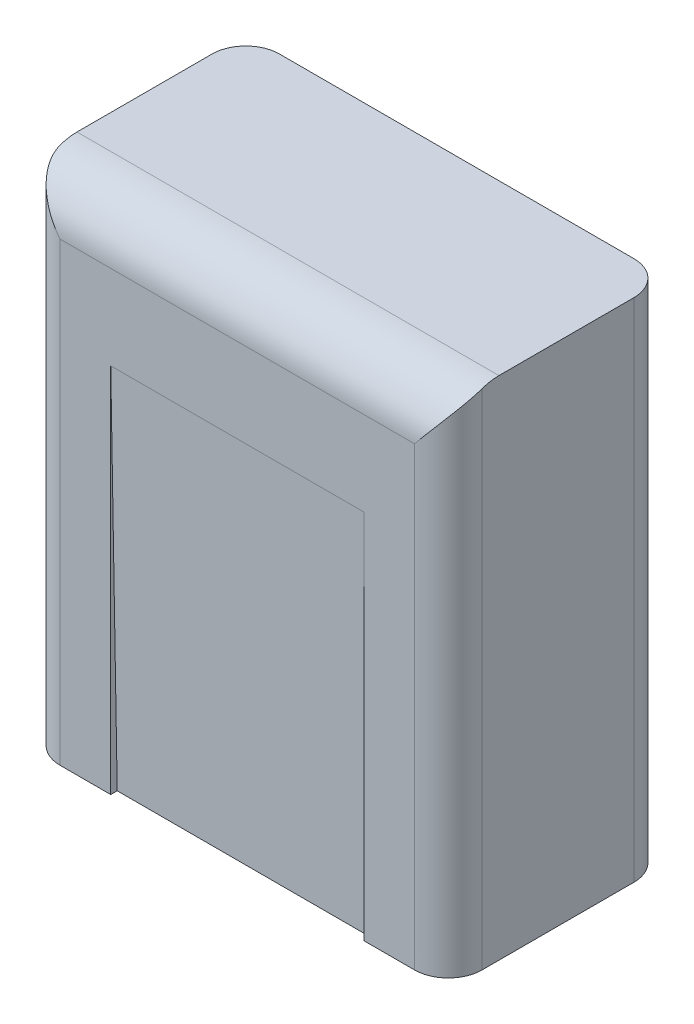
ISO-10303-21;
HEADER;
FILE_DESCRIPTION(('STEP AP214'),'2;1');
FILE_NAME('part.step','',(''),(''),'','','');
FILE_SCHEMA(('AUTOMOTIVE_DESIGN { 1 0 10303 214 1 1 1 1 }'));
ENDSEC;
DATA;
#1=APPLICATION_CONTEXT('core data for automotive mechanical design processes');
#2=APPLICATION_PROTOCOL_DEFINITION('international standard','automotive_design',2000,#1);
#3=PRODUCT_CONTEXT('',#1,'mechanical');
#4=PRODUCT('Part','Part','',(#3));
#5=PRODUCT_RELATED_PRODUCT_CATEGORY('part','',(#4));
#6=PRODUCT_DEFINITION_FORMATION('','',#4);
#7=PRODUCT_DEFINITION_CONTEXT('part definition',#1,'design');
#8=PRODUCT_DEFINITION('design','',#6,#7);
#9=PRODUCT_DEFINITION_SHAPE('','',#8);
#10=(LENGTH_UNIT() NAMED_UNIT(*) SI_UNIT(.MILLI.,.METRE.));
#11=(NAMED_UNIT(*) PLANE_ANGLE_UNIT() SI_UNIT($,.RADIAN.));
#12=(NAMED_UNIT(*) SI_UNIT($,.STERADIAN.) SOLID_ANGLE_UNIT());
#13=UNCERTAINTY_MEASURE_WITH_UNIT(LENGTH_MEASURE(1.E-05),#10,'distance_accuracy_value','');
#14=(GEOMETRIC_REPRESENTATION_CONTEXT(3) GLOBAL_UNCERTAINTY_ASSIGNED_CONTEXT((#13)) GLOBAL_UNIT_ASSIGNED_CONTEXT((#10,
#11,#12)) REPRESENTATION_CONTEXT('',''));
#15=CARTESIAN_POINT('',(0.,0.,0.));
#16=DIRECTION('',(0.,0.,1.));
#17=DIRECTION('',(1.,0.,0.));
#18=AXIS2_PLACEMENT_3D('',#15,#16,#17);
#19=CARTESIAN_POINT('',(-12.5,-30.,6.5));
#20=DIRECTION('',(0.,0.,1.));
#21=DIRECTION('',(1.,0.,0.));
#22=AXIS2_PLACEMENT_3D('',#19,#20,#21);
#23=PLANE('',#22);
#24=DIRECTION('',(1.,0.,0.));
#25=VECTOR('',#24,1.);
#26=CARTESIAN_POINT('',(-12.5,-30.,6.5));
#27=LINE('',#26,#25);
#28=CARTESIAN_POINT('',(-10.5,-30.,6.5));
#29=VERTEX_POINT('',#28);
#30=CARTESIAN_POINT('',(-7.5,-30.,6.5));
#31=VERTEX_POINT('',#30);
#32=EDGE_CURVE('E161',#29,#31,#27,.T.);
#33=ORIENTED_EDGE('',*,*,#32,.T.);
#34=DIRECTION('',(0.,-1.,0.));
#35=VECTOR('',#34,1.);
#36=CARTESIAN_POINT('',(-7.5,-30.,6.5));
#37=LINE('',#36,#35);
#38=CARTESIAN_POINT('',(-7.5,-8.,6.5));
#39=VERTEX_POINT('',#38);
#40=EDGE_CURVE('E147',#39,#31,#37,.T.);
#41=ORIENTED_EDGE('',*,*,#40,.F.);
#42=DIRECTION('',(1.,0.,0.));
#43=VECTOR('',#42,1.);
#44=CARTESIAN_POINT('',(-7.5,-8.,6.5));
#45=LINE('',#44,#43);
#46=CARTESIAN_POINT('',(7.5,-8.,6.5));
#47=VERTEX_POINT('',#46);
#48=EDGE_CURVE('E290',#39,#47,#45,.T.);
#49=ORIENTED_EDGE('',*,*,#48,.T.);
#50=DIRECTION('',(0.,-1.,0.));
#51=VECTOR('',#50,1.);
#52=CARTESIAN_POINT('',(7.5,-30.,6.5));
#53=LINE('',#52,#51);
#54=CARTESIAN_POINT('',(7.5,-30.,6.5));
#55=VERTEX_POINT('',#54);
#56=EDGE_CURVE('E296',#47,#55,#53,.T.);
#57=ORIENTED_EDGE('',*,*,#56,.T.);
#58=CARTESIAN_POINT('',(10.5,-30.,6.5));
#59=VERTEX_POINT('',#58);
#60=EDGE_CURVE('E168',#55,#59,#27,.T.);
#61=ORIENTED_EDGE('',*,*,#60,.T.);
#62=DIRECTION('',(0.,1.,0.));
#63=VECTOR('',#62,1.);
#64=CARTESIAN_POINT('',(10.5,-30.,6.5));
#65=LINE('',#64,#63);
#66=CARTESIAN_POINT('',(10.5,-3.,6.5));
#67=VERTEX_POINT('',#66);
#68=EDGE_CURVE('E205',#59,#67,#65,.T.);
#69=ORIENTED_EDGE('',*,*,#68,.T.);
#70=DIRECTION('',(1.,0.,0.));
#71=VECTOR('',#70,1.);
#72=CARTESIAN_POINT('',(-10.5,-3.,6.5));
#73=LINE('',#72,#71);
#74=CARTESIAN_POINT('',(-10.5,-3.,6.5));
#75=VERTEX_POINT('',#74);
#76=EDGE_CURVE('E225',#67,#75,#73,.F.);
#77=ORIENTED_EDGE('',*,*,#76,.T.);
#78=DIRECTION('',(0.,1.,0.));
#79=VECTOR('',#78,1.);
#80=CARTESIAN_POINT('',(-10.5,-30.,6.5));
#81=LINE('',#80,#79);
#82=EDGE_CURVE('E166',#75,#29,#81,.F.);
#83=ORIENTED_EDGE('',*,*,#82,.T.);
#84=EDGE_LOOP('',(#33,#41,#49,#57,#61,#69,#77,#83));
#85=FACE_BOUND('',#84,.T.);
#86=ADVANCED_FACE('F51',(#85),#23,.T.);
#87=CARTESIAN_POINT('',(0.,-30.,0.));
#88=DIRECTION('',(0.,-1.,0.));
#89=DIRECTION('',(0.,0.,-1.));
#90=AXIS2_PLACEMENT_3D('',#87,#88,#89);
#91=PLANE('',#90);
#92=CARTESIAN_POINT('',(5.,-30.,0.));
#93=DIRECTION('',(0.,-1.,0.));
#94=DIRECTION('',(0.,0.,-1.));
#95=AXIS2_PLACEMENT_3D('',#92,#93,#94);
#96=CIRCLE('',#95,3.025);
#97=CARTESIAN_POINT('',(5.,-30.,-3.025));
#98=VERTEX_POINT('',#97);
#99=EDGE_CURVE('E287',#98,#98,#96,.T.);
#100=ORIENTED_EDGE('',*,*,#99,.F.);
#101=EDGE_LOOP('',(#100));
#102=FACE_BOUND('',#101,.T.);
#103=CARTESIAN_POINT('',(-5.,-30.,0.));
#104=DIRECTION('',(0.,-1.,0.));
#105=DIRECTION('',(0.,0.,-1.));
#106=AXIS2_PLACEMENT_3D('',#103,#104,#105);
#107=CIRCLE('',#106,3.025);
#108=CARTESIAN_POINT('',(-5.,-30.,-3.025));
#109=VERTEX_POINT('',#108);
#110=EDGE_CURVE('E278',#109,#109,#107,.T.);
#111=ORIENTED_EDGE('',*,*,#110,.F.);
#112=EDGE_LOOP('',(#111));
#113=FACE_BOUND('',#112,.T.);
#114=DIRECTION('',(1.,0.,0.));
#115=VECTOR('',#114,1.);
#116=CARTESIAN_POINT('',(-7.5,-30.,6.11598857157936));
#117=LINE('',#116,#115);
#118=CARTESIAN_POINT('',(-7.5,-30.,6.11598857157936));
#119=VERTEX_POINT('',#118);
#120=CARTESIAN_POINT('',(7.5,-30.,6.11598857157936));
#121=VERTEX_POINT('',#120);
#122=EDGE_CURVE('E164',#119,#121,#117,.T.);
#123=ORIENTED_EDGE('',*,*,#122,.F.);
#124=DIRECTION('',(0.,0.,-1.));
#125=VECTOR('',#124,1.);
#126=CARTESIAN_POINT('',(-7.5,-30.,6.11598857157936));
#127=LINE('',#126,#125);
#128=EDGE_CURVE('E150',#31,#119,#127,.T.);
#129=ORIENTED_EDGE('',*,*,#128,.F.);
#130=ORIENTED_EDGE('',*,*,#32,.F.);
#131=CARTESIAN_POINT('',(-10.5,-30.,4.5));
#132=DIRECTION('',(0.,-1.,0.));
#133=DIRECTION('',(0.,0.,-1.));
#134=AXIS2_PLACEMENT_3D('',#131,#132,#133);
#135=CIRCLE('',#134,2.);
#136=CARTESIAN_POINT('',(-12.5,-30.,4.5));
#137=VERTEX_POINT('',#136);
#138=EDGE_CURVE('E201',#29,#137,#135,.T.);
#139=ORIENTED_EDGE('',*,*,#138,.T.);
#140=DIRECTION('',(0.,0.,1.));
#141=VECTOR('',#140,1.);
#142=CARTESIAN_POINT('',(-12.5,-30.,6.5));
#143=LINE('',#142,#141);
#144=CARTESIAN_POINT('',(-12.5,-30.,-4.5));
#145=VERTEX_POINT('',#144);
#146=EDGE_CURVE('E172',#145,#137,#143,.T.);
#147=ORIENTED_EDGE('',*,*,#146,.F.);
#148=CARTESIAN_POINT('',(-10.5,-30.,-4.5));
#149=DIRECTION('',(0.,-1.,0.));
#150=DIRECTION('',(0.,0.,-1.));
#151=AXIS2_PLACEMENT_3D('',#148,#149,#150);
#152=CIRCLE('',#151,2.);
#153=CARTESIAN_POINT('',(-10.5,-30.,-6.5));
#154=VERTEX_POINT('',#153);
#155=EDGE_CURVE('E203',#145,#154,#152,.T.);
#156=ORIENTED_EDGE('',*,*,#155,.T.);
#157=DIRECTION('',(-1.,0.,0.));
#158=VECTOR('',#157,1.);
#159=CARTESIAN_POINT('',(-12.5,-30.,-6.5));
#160=LINE('',#159,#158);
#161=CARTESIAN_POINT('',(10.5,-30.,-6.5));
#162=VERTEX_POINT('',#161);
#163=EDGE_CURVE('E268',#162,#154,#160,.T.);
#164=ORIENTED_EDGE('',*,*,#163,.F.);
#165=CARTESIAN_POINT('',(10.5,-30.,-4.5));
#166=DIRECTION('',(0.,-1.,0.));
#167=DIRECTION('',(0.,0.,-1.));
#168=AXIS2_PLACEMENT_3D('',#165,#166,#167);
#169=CIRCLE('',#168,2.);
#170=CARTESIAN_POINT('',(12.5,-30.,-4.5));
#171=VERTEX_POINT('',#170);
#172=EDGE_CURVE('E199',#162,#171,#169,.T.);
#173=ORIENTED_EDGE('',*,*,#172,.T.);
#174=DIRECTION('',(0.,0.,-1.));
#175=VECTOR('',#174,1.);
#176=CARTESIAN_POINT('',(12.5,-30.,6.5));
#177=LINE('',#176,#175);
#178=CARTESIAN_POINT('',(12.5,-30.,4.5));
#179=VERTEX_POINT('',#178);
#180=EDGE_CURVE('E184',#179,#171,#177,.T.);
#181=ORIENTED_EDGE('',*,*,#180,.F.);
#182=CARTESIAN_POINT('',(10.5,-30.,4.5));
#183=DIRECTION('',(0.,-1.,0.));
#184=DIRECTION('',(0.,0.,-1.));
#185=AXIS2_PLACEMENT_3D('',#182,#183,#184);
#186=CIRCLE('',#185,2.);
#187=EDGE_CURVE('E196',#179,#59,#186,.T.);
#188=ORIENTED_EDGE('',*,*,#187,.T.);
#189=ORIENTED_EDGE('',*,*,#60,.F.);
#190=DIRECTION('',(0.,0.,-1.));
#191=VECTOR('',#190,1.);
#192=CARTESIAN_POINT('',(7.5,-30.,6.11598857157936));
#193=LINE('',#192,#191);
#194=EDGE_CURVE('E294',#55,#121,#193,.T.);
#195=ORIENTED_EDGE('',*,*,#194,.T.);
#196=EDGE_LOOP('',(#123,#129,#130,#139,#147,#156,#164,#173,#181,#188,#189,#195));
#197=FACE_BOUND('',#196,.T.);
#198=ADVANCED_FACE('F160',(#102,#113,#197),#91,.T.);
#199=CARTESIAN_POINT('',(12.5,-30.,6.5));
#200=DIRECTION('',(1.,0.,0.));
#201=DIRECTION('',(0.,0.,-1.));
#202=AXIS2_PLACEMENT_3D('',#199,#200,#201);
#203=PLANE('',#202);
#204=DIRECTION('',(0.,0.,-1.));
#205=VECTOR('',#204,1.);
#206=CARTESIAN_POINT('',(12.5,0.,6.5));
#207=LINE('',#206,#205);
#208=CARTESIAN_POINT('',(12.5,0.,3.5));
#209=VERTEX_POINT('',#208);
#210=CARTESIAN_POINT('',(12.5,0.,-4.5));
#211=VERTEX_POINT('',#210);
#212=EDGE_CURVE('E176',#209,#211,#207,.T.);
#213=ORIENTED_EDGE('',*,*,#212,.F.);
#214=CARTESIAN_POINT('',(12.5,-3.,3.5));
#215=DIRECTION('',(1.,0.,0.));
#216=DIRECTION('',(0.,0.,-1.));
#217=AXIS2_PLACEMENT_3D('',#214,#215,#216);
#218=CIRCLE('',#217,3.);
#219=CARTESIAN_POINT('',(12.5,-0.171572875253809,4.5));
#220=VERTEX_POINT('',#219);
#221=EDGE_CURVE('E217',#209,#220,#218,.T.);
#222=ORIENTED_EDGE('',*,*,#221,.T.);
#223=DIRECTION('',(0.,1.,0.));
#224=VECTOR('',#223,1.);
#225=CARTESIAN_POINT('',(12.5,-30.,4.5));
#226=LINE('',#225,#224);
#227=EDGE_CURVE('E209',#220,#179,#226,.F.);
#228=ORIENTED_EDGE('',*,*,#227,.T.);
#229=ORIENTED_EDGE('',*,*,#180,.T.);
#230=DIRECTION('',(0.,1.,0.));
#231=VECTOR('',#230,1.);
#232=CARTESIAN_POINT('',(12.5,-30.,-4.5));
#233=LINE('',#232,#231);
#234=EDGE_CURVE('E211',#171,#211,#233,.T.);
#235=ORIENTED_EDGE('',*,*,#234,.T.);
#236=EDGE_LOOP('',(#213,#222,#228,#229,#235));
#237=FACE_BOUND('',#236,.T.);
#238=ADVANCED_FACE('F304',(#237),#203,.T.);
#239=CARTESIAN_POINT('',(-12.5,-30.,6.5));
#240=DIRECTION('',(-1.,0.,0.));
#241=DIRECTION('',(0.,0.,1.));
#242=AXIS2_PLACEMENT_3D('',#239,#240,#241);
#243=PLANE('',#242);
#244=DIRECTION('',(0.,1.,0.));
#245=VECTOR('',#244,1.);
#246=CARTESIAN_POINT('',(-12.5,-30.,4.5));
#247=LINE('',#246,#245);
#248=CARTESIAN_POINT('',(-12.5,-0.17157287525381,4.5));
#249=VERTEX_POINT('',#248);
#250=EDGE_CURVE('E192',#137,#249,#247,.T.);
#251=ORIENTED_EDGE('',*,*,#250,.T.);
#252=CARTESIAN_POINT('',(-12.5,-3.,3.5));
#253=DIRECTION('',(-1.,0.,0.));
#254=DIRECTION('',(0.,0.,1.));
#255=AXIS2_PLACEMENT_3D('',#252,#253,#254);
#256=CIRCLE('',#255,3.);
#257=CARTESIAN_POINT('',(-12.5,0.,3.5));
#258=VERTEX_POINT('',#257);
#259=EDGE_CURVE('E11',#249,#258,#256,.T.);
#260=ORIENTED_EDGE('',*,*,#259,.T.);
#261=DIRECTION('',(0.,0.,1.));
#262=VECTOR('',#261,1.);
#263=CARTESIAN_POINT('',(-12.5,0.,6.5));
#264=LINE('',#263,#262);
#265=CARTESIAN_POINT('',(-12.5,0.,-4.5));
#266=VERTEX_POINT('',#265);
#267=EDGE_CURVE('E182',#266,#258,#264,.T.);
#268=ORIENTED_EDGE('',*,*,#267,.F.);
#269=DIRECTION('',(0.,1.,0.));
#270=VECTOR('',#269,1.);
#271=CARTESIAN_POINT('',(-12.5,-30.,-4.5));
#272=LINE('',#271,#270);
#273=EDGE_CURVE('E194',#266,#145,#272,.F.);
#274=ORIENTED_EDGE('',*,*,#273,.T.);
#275=ORIENTED_EDGE('',*,*,#146,.T.);
#276=EDGE_LOOP('',(#251,#260,#268,#274,#275));
#277=FACE_BOUND('',#276,.T.);
#278=ADVANCED_FACE('F253',(#277),#243,.T.);
#279=CARTESIAN_POINT('',(-12.5,-30.,-6.5));
#280=DIRECTION('',(0.,0.,-1.));
#281=DIRECTION('',(-1.,0.,0.));
#282=AXIS2_PLACEMENT_3D('',#279,#280,#281);
#283=PLANE('',#282);
#284=ORIENTED_EDGE('',*,*,#163,.T.);
#285=DIRECTION('',(0.,1.,0.));
#286=VECTOR('',#285,1.);
#287=CARTESIAN_POINT('',(-10.5,-30.,-6.5));
#288=LINE('',#287,#286);
#289=CARTESIAN_POINT('',(-10.5,0.,-6.5));
#290=VERTEX_POINT('',#289);
#291=EDGE_CURVE('E170',#154,#290,#288,.T.);
#292=ORIENTED_EDGE('',*,*,#291,.T.);
#293=DIRECTION('',(-1.,0.,0.));
#294=VECTOR('',#293,1.);
#295=CARTESIAN_POINT('',(-12.5,0.,-6.5));
#296=LINE('',#295,#294);
#297=CARTESIAN_POINT('',(10.5,0.,-6.5));
#298=VERTEX_POINT('',#297);
#299=EDGE_CURVE('E178',#298,#290,#296,.T.);
#300=ORIENTED_EDGE('',*,*,#299,.F.);
#301=DIRECTION('',(0.,1.,0.));
#302=VECTOR('',#301,1.);
#303=CARTESIAN_POINT('',(10.5,-30.,-6.5));
#304=LINE('',#303,#302);
#305=EDGE_CURVE('E167',#298,#162,#304,.F.);
#306=ORIENTED_EDGE('',*,*,#305,.T.);
#307=EDGE_LOOP('',(#284,#292,#300,#306));
#308=FACE_BOUND('',#307,.T.);
#309=ADVANCED_FACE('F265',(#308),#283,.T.);
#310=CARTESIAN_POINT('',(0.,0.,0.));
#311=DIRECTION('',(0.,-1.,0.));
#312=DIRECTION('',(0.,0.,-1.));
#313=AXIS2_PLACEMENT_3D('',#310,#311,#312);
#314=PLANE('',#313);
#315=ORIENTED_EDGE('',*,*,#267,.T.);
#316=DIRECTION('',(1.,0.,0.));
#317=VECTOR('',#316,1.);
#318=CARTESIAN_POINT('',(10.5,0.,3.5));
#319=LINE('',#318,#317);
#320=EDGE_CURVE('E214',#258,#209,#319,.T.);
#321=ORIENTED_EDGE('',*,*,#320,.T.);
#322=ORIENTED_EDGE('',*,*,#212,.T.);
#323=CARTESIAN_POINT('',(10.5,0.,-4.5));
#324=DIRECTION('',(0.,-1.,0.));
#325=DIRECTION('',(0.,0.,-1.));
#326=AXIS2_PLACEMENT_3D('',#323,#324,#325);
#327=CIRCLE('',#326,2.);
#328=EDGE_CURVE('E188',#211,#298,#327,.F.);
#329=ORIENTED_EDGE('',*,*,#328,.T.);
#330=ORIENTED_EDGE('',*,*,#299,.T.);
#331=CARTESIAN_POINT('',(-10.5,0.,-4.5));
#332=DIRECTION('',(0.,-1.,0.));
#333=DIRECTION('',(0.,0.,-1.));
#334=AXIS2_PLACEMENT_3D('',#331,#332,#333);
#335=CIRCLE('',#334,2.);
#336=EDGE_CURVE('E190',#290,#266,#335,.F.);
#337=ORIENTED_EDGE('',*,*,#336,.T.);
#338=EDGE_LOOP('',(#315,#321,#322,#329,#330,#337));
#339=FACE_BOUND('',#338,.T.);
#340=ADVANCED_FACE('F257',(#339),#314,.F.);
#341=CARTESIAN_POINT('',(-10.5,-30.,-4.5));
#342=DIRECTION('',(0.,1.,0.));
#343=DIRECTION('',(0.,0.,1.));
#344=AXIS2_PLACEMENT_3D('',#341,#342,#343);
#345=CYLINDRICAL_SURFACE('',#344,2.);
#346=ORIENTED_EDGE('',*,*,#155,.F.);
#347=ORIENTED_EDGE('',*,*,#273,.F.);
#348=ORIENTED_EDGE('',*,*,#336,.F.);
#349=ORIENTED_EDGE('',*,*,#291,.F.);
#350=EDGE_LOOP('',(#346,#347,#348,#349));
#351=FACE_BOUND('',#350,.T.);
#352=ADVANCED_FACE('F239',(#351),#345,.T.);
#353=CARTESIAN_POINT('',(-10.5,-30.,4.5));
#354=DIRECTION('',(0.,1.,0.));
#355=DIRECTION('',(0.,0.,1.));
#356=AXIS2_PLACEMENT_3D('',#353,#354,#355);
#357=CYLINDRICAL_SURFACE('',#356,2.);
#358=ORIENTED_EDGE('',*,*,#82,.F.);
#359=CARTESIAN_POINT('',(-12.5,-0.171572875253809,4.5));
#360=CARTESIAN_POINT('',(-12.5000084449649,-0.19149294973119,4.55638405555257));
#361=CARTESIAN_POINT('',(-12.4976165290429,-0.213113026951954,4.61213090524145));
#362=CARTESIAN_POINT('',(-12.4884161031397,-0.259452787780402,4.72185097214104));
#363=CARTESIAN_POINT('',(-12.4816143557198,-0.28416767868531,4.77582677235699));
#364=CARTESIAN_POINT('',(-12.4640650089645,-0.336195675457498,4.88114703210528));
#365=CARTESIAN_POINT('',(-12.4533578782159,-0.363480077625333,4.93251253251162));
#366=CARTESIAN_POINT('',(-12.428383343086,-0.420570081191317,5.03293300898971));
#367=CARTESIAN_POINT('',(-12.4141142613294,-0.450376866033002,5.08198688350807));
#368=CARTESIAN_POINT('',(-12.3593269063569,-0.557235204806671,5.24710684622474));
#369=CARTESIAN_POINT('',(-12.3107991236012,-0.639990691269774,5.35695114231588));
#370=CARTESIAN_POINT('',(-12.199579870891,-0.81552818334487,5.56066196172696));
#371=CARTESIAN_POINT('',(-12.1368256750297,-0.908353613562807,5.65445439532711));
#372=CARTESIAN_POINT('',(-11.9749333169946,-1.13830760334613,5.85925720363039));
#373=CARTESIAN_POINT('',(-11.8711102120254,-1.2786858419373,5.96289727870954));
#374=CARTESIAN_POINT('',(-11.6512915720566,-1.56777829054137,6.14153331793482));
#375=CARTESIAN_POINT('',(-11.5352792281827,-1.71650387636297,6.2164890478937));
#376=CARTESIAN_POINT('',(-11.3432419274776,-1.95911372234941,6.31536669032298));
#377=CARTESIAN_POINT('',(-11.269505033522,-2.05147691559191,6.34775479636274));
#378=CARTESIAN_POINT('',(-11.1201250475232,-2.23748721104573,6.40310220476015));
#379=CARTESIAN_POINT('',(-11.0444813343816,-2.3311347269433,6.42605839166327));
#380=CARTESIAN_POINT('',(-10.8160659756589,-2.6128902505377,6.48105514873023));
#381=CARTESIAN_POINT('',(-10.6613491422737,-2.80238832588654,6.4994534063341));
#382=CARTESIAN_POINT('',(-10.504618731357,-2.99434323024007,6.49999599518123));
#383=CARTESIAN_POINT('',(-10.502309327745,-2.99717166041597,6.49999999478464));
#384=CARTESIAN_POINT('',(-10.5,-3.,6.5));
#385=B_SPLINE_CURVE_WITH_KNOTS('',3,(#359,#360,#361,#362,#363,#364,#365,#366,#367,#368,#369,
#370,#371,#372,#373,#374,#375,#376,#377,#378,#379,#380,#381,#382,#383,#384),.UNSPECIFIED.,.F.,
.F.,(4,2,2,2,2,2,2,2,2,2,2,2,4),(0.,0.179272158824226,0.358270048541719,0.535463494925256,
0.712740542250161,1.14766579663324,1.58454732757419,2.19039501983592,2.79708941843106,
3.16434808038176,3.53172795410126,4.2641894371729,4.2751438948957),.UNSPECIFIED.);
#386=EDGE_CURVE('E60',#75,#249,#385,.F.);
#387=ORIENTED_EDGE('',*,*,#386,.T.);
#388=ORIENTED_EDGE('',*,*,#250,.F.);
#389=ORIENTED_EDGE('',*,*,#138,.F.);
#390=EDGE_LOOP('',(#358,#387,#388,#389));
#391=FACE_BOUND('',#390,.T.);
#392=ADVANCED_FACE('F234',(#391),#357,.T.);
#393=CARTESIAN_POINT('',(10.5,-30.,-4.5));
#394=DIRECTION('',(0.,1.,0.));
#395=DIRECTION('',(0.,0.,1.));
#396=AXIS2_PLACEMENT_3D('',#393,#394,#395);
#397=CYLINDRICAL_SURFACE('',#396,2.);
#398=ORIENTED_EDGE('',*,*,#172,.F.);
#399=ORIENTED_EDGE('',*,*,#305,.F.);
#400=ORIENTED_EDGE('',*,*,#328,.F.);
#401=ORIENTED_EDGE('',*,*,#234,.F.);
#402=EDGE_LOOP('',(#398,#399,#400,#401));
#403=FACE_BOUND('',#402,.T.);
#404=ADVANCED_FACE('F230',(#403),#397,.T.);
#405=CARTESIAN_POINT('',(10.5,-30.,4.5));
#406=DIRECTION('',(0.,1.,0.));
#407=DIRECTION('',(0.,0.,1.));
#408=AXIS2_PLACEMENT_3D('',#405,#406,#407);
#409=CYLINDRICAL_SURFACE('',#408,2.);
#410=ORIENTED_EDGE('',*,*,#227,.F.);
#411=CARTESIAN_POINT('',(12.5,-0.171572875253809,4.5));
#412=CARTESIAN_POINT('',(12.5000084449649,-0.19149294973119,4.55638405555257));
#413=CARTESIAN_POINT('',(12.4976165290429,-0.213113026951954,4.61213090524145));
#414=CARTESIAN_POINT('',(12.4884161031397,-0.259452787780402,4.72185097214104));
#415=CARTESIAN_POINT('',(12.4816143557198,-0.28416767868531,4.77582677235699));
#416=CARTESIAN_POINT('',(12.4640650089645,-0.336195675457499,4.88114703210528));
#417=CARTESIAN_POINT('',(12.4533578782159,-0.363480077625333,4.93251253251162));
#418=CARTESIAN_POINT('',(12.428383343086,-0.420570081191317,5.03293300898971));
#419=CARTESIAN_POINT('',(12.4141142613294,-0.450376866033002,5.08198688350807));
#420=CARTESIAN_POINT('',(12.3593269063569,-0.55723520480667,5.24710684622474));
#421=CARTESIAN_POINT('',(12.3107991236012,-0.639990691269774,5.35695114231588));
#422=CARTESIAN_POINT('',(12.199579870891,-0.81552818334487,5.56066196172696));
#423=CARTESIAN_POINT('',(12.1368256750297,-0.908353613562806,5.65445439532711));
#424=CARTESIAN_POINT('',(11.9749333169946,-1.13830760334613,5.85925720363039));
#425=CARTESIAN_POINT('',(11.8711102120254,-1.2786858419373,5.96289727870954));
#426=CARTESIAN_POINT('',(11.6512915720566,-1.56777829054137,6.14153331793482));
#427=CARTESIAN_POINT('',(11.5352792281827,-1.71650387636297,6.2164890478937));
#428=CARTESIAN_POINT('',(11.3432419274776,-1.95911372234941,6.31536669032298));
#429=CARTESIAN_POINT('',(11.269505033522,-2.05147691559191,6.34775479636274));
#430=CARTESIAN_POINT('',(11.1201250475232,-2.23748721104573,6.40310220476015));
#431=CARTESIAN_POINT('',(11.0444813343816,-2.3311347269433,6.42605839166327));
#432=CARTESIAN_POINT('',(10.8160659756589,-2.6128902505377,6.48105514873023));
#433=CARTESIAN_POINT('',(10.6613491422737,-2.80238832588654,6.4994534063341));
#434=CARTESIAN_POINT('',(10.504618731357,-2.99434323024007,6.49999599518123));
#435=CARTESIAN_POINT('',(10.502309327745,-2.99717166041597,6.49999999478464));
#436=CARTESIAN_POINT('',(10.5,-3.,6.5));
#437=B_SPLINE_CURVE_WITH_KNOTS('',3,(#411,#412,#413,#414,#415,#416,#417,#418,#419,#420,#421,
#422,#423,#424,#425,#426,#427,#428,#429,#430,#431,#432,#433,#434,#435,#436),.UNSPECIFIED.,.F.,
.F.,(4,2,2,2,2,2,2,2,2,2,2,2,4),(0.,0.179272158824226,0.35827004854172,0.535463494925256,
0.712740542250161,1.14766579663324,1.58454732757419,2.19039501983592,2.79708941843106,
3.16434808038176,3.53172795410126,4.2641894371729,4.2751438948957),.UNSPECIFIED.);
#438=EDGE_CURVE('E219',#220,#67,#437,.T.);
#439=ORIENTED_EDGE('',*,*,#438,.T.);
#440=ORIENTED_EDGE('',*,*,#68,.F.);
#441=ORIENTED_EDGE('',*,*,#187,.F.);
#442=EDGE_LOOP('',(#410,#439,#440,#441));
#443=FACE_BOUND('',#442,.T.);
#444=ADVANCED_FACE('F226',(#443),#409,.T.);
#445=CARTESIAN_POINT('',(0.,-3.,3.5));
#446=DIRECTION('',(-1.,0.,0.));
#447=DIRECTION('',(0.,0.,1.));
#448=AXIS2_PLACEMENT_3D('',#445,#446,#447);
#449=CYLINDRICAL_SURFACE('',#448,3.);
#450=ORIENTED_EDGE('',*,*,#386,.F.);
#451=ORIENTED_EDGE('',*,*,#76,.F.);
#452=ORIENTED_EDGE('',*,*,#438,.F.);
#453=ORIENTED_EDGE('',*,*,#221,.F.);
#454=ORIENTED_EDGE('',*,*,#320,.F.);
#455=ORIENTED_EDGE('',*,*,#259,.F.);
#456=EDGE_LOOP('',(#450,#451,#452,#453,#454,#455));
#457=FACE_BOUND('',#456,.T.);
#458=ADVANCED_FACE('F53',(#457),#449,.T.);
#459=CARTESIAN_POINT('',(-5.,-13.,0.));
#460=DIRECTION('',(0.,-1.,0.));
#461=DIRECTION('',(0.,0.,-1.));
#462=AXIS2_PLACEMENT_3D('',#459,#460,#461);
#463=CONICAL_SURFACE('',#462,2.49999999999999,1.02974425867665);
#464=CARTESIAN_POINT('',(-5.,-11.4978484524311,0.));
#465=VERTEX_POINT('',#464);
#466=VERTEX_LOOP('',#465);
#467=FACE_BOUND('',#466,.T.);
#468=CARTESIAN_POINT('',(-5.,-13.,0.));
#469=DIRECTION('',(0.,-1.,0.));
#470=DIRECTION('',(0.,0.,-1.));
#471=AXIS2_PLACEMENT_3D('',#468,#469,#470);
#472=CIRCLE('',#471,2.49999999999999);
#473=CARTESIAN_POINT('',(-5.,-13.,-2.49999999999999));
#474=VERTEX_POINT('',#473);
#475=EDGE_CURVE('E179',#474,#474,#472,.T.);
#476=ORIENTED_EDGE('',*,*,#475,.T.);
#477=EDGE_LOOP('',(#476));
#478=FACE_BOUND('',#477,.T.);
#479=ADVANCED_FACE('F356',(#467,#478),#463,.F.);
#480=CARTESIAN_POINT('',(-5.,-30.,0.));
#481=DIRECTION('',(0.,-1.,0.));
#482=DIRECTION('',(0.,0.,-1.));
#483=AXIS2_PLACEMENT_3D('',#480,#481,#482);
#484=CYLINDRICAL_SURFACE('',#483,2.49999999999999);
#485=ORIENTED_EDGE('',*,*,#475,.F.);
#486=EDGE_LOOP('',(#485));
#487=FACE_BOUND('',#486,.T.);
#488=CARTESIAN_POINT('',(-5.,-29.475,0.));
#489=DIRECTION('',(0.,-1.,0.));
#490=DIRECTION('',(0.,0.,-1.));
#491=AXIS2_PLACEMENT_3D('',#488,#489,#490);
#492=CIRCLE('',#491,2.5);
#493=CARTESIAN_POINT('',(-5.,-29.475,-2.5));
#494=VERTEX_POINT('',#493);
#495=EDGE_CURVE('E275',#494,#494,#492,.T.);
#496=ORIENTED_EDGE('',*,*,#495,.T.);
#497=EDGE_LOOP('',(#496));
#498=FACE_BOUND('',#497,.T.);
#499=ADVANCED_FACE('F364',(#487,#498),#484,.F.);
#500=CARTESIAN_POINT('',(-5.,-30.,0.));
#501=DIRECTION('',(0.,-1.,0.));
#502=DIRECTION('',(0.,0.,-1.));
#503=AXIS2_PLACEMENT_3D('',#500,#501,#502);
#504=CONICAL_SURFACE('',#503,3.025,0.785398163397449);
#505=ORIENTED_EDGE('',*,*,#495,.F.);
#506=EDGE_LOOP('',(#505));
#507=FACE_BOUND('',#506,.T.);
#508=ORIENTED_EDGE('',*,*,#110,.T.);
#509=EDGE_LOOP('',(#508));
#510=FACE_BOUND('',#509,.T.);
#511=ADVANCED_FACE('F375',(#507,#510),#504,.F.);
#512=CARTESIAN_POINT('',(5.,-13.,0.));
#513=DIRECTION('',(0.,-1.,0.));
#514=DIRECTION('',(0.,0.,-1.));
#515=AXIS2_PLACEMENT_3D('',#512,#513,#514);
#516=CONICAL_SURFACE('',#515,2.49999999999999,1.02974425867665);
#517=CARTESIAN_POINT('',(5.,-11.4978484524311,0.));
#518=VERTEX_POINT('',#517);
#519=VERTEX_LOOP('',#518);
#520=FACE_BOUND('',#519,.T.);
#521=CARTESIAN_POINT('',(5.,-13.,0.));
#522=DIRECTION('',(0.,-1.,0.));
#523=DIRECTION('',(0.,0.,-1.));
#524=AXIS2_PLACEMENT_3D('',#521,#522,#523);
#525=CIRCLE('',#524,2.49999999999999);
#526=CARTESIAN_POINT('',(5.,-13.,-2.49999999999999));
#527=VERTEX_POINT('',#526);
#528=EDGE_CURVE('E281',#527,#527,#525,.T.);
#529=ORIENTED_EDGE('',*,*,#528,.T.);
#530=EDGE_LOOP('',(#529));
#531=FACE_BOUND('',#530,.T.);
#532=ADVANCED_FACE('F387',(#520,#531),#516,.F.);
#533=CARTESIAN_POINT('',(5.,-30.,0.));
#534=DIRECTION('',(0.,-1.,0.));
#535=DIRECTION('',(0.,0.,-1.));
#536=AXIS2_PLACEMENT_3D('',#533,#534,#535);
#537=CYLINDRICAL_SURFACE('',#536,2.49999999999999);
#538=ORIENTED_EDGE('',*,*,#528,.F.);
#539=EDGE_LOOP('',(#538));
#540=FACE_BOUND('',#539,.T.);
#541=CARTESIAN_POINT('',(5.,-29.475,0.));
#542=DIRECTION('',(0.,-1.,0.));
#543=DIRECTION('',(0.,0.,-1.));
#544=AXIS2_PLACEMENT_3D('',#541,#542,#543);
#545=CIRCLE('',#544,2.5);
#546=CARTESIAN_POINT('',(5.,-29.475,-2.5));
#547=VERTEX_POINT('',#546);
#548=EDGE_CURVE('E284',#547,#547,#545,.T.);
#549=ORIENTED_EDGE('',*,*,#548,.T.);
#550=EDGE_LOOP('',(#549));
#551=FACE_BOUND('',#550,.T.);
#552=ADVANCED_FACE('F397',(#540,#551),#537,.F.);
#553=CARTESIAN_POINT('',(5.,-30.,0.));
#554=DIRECTION('',(0.,-1.,0.));
#555=DIRECTION('',(0.,0.,-1.));
#556=AXIS2_PLACEMENT_3D('',#553,#554,#555);
#557=CONICAL_SURFACE('',#556,3.025,0.785398163397448);
#558=ORIENTED_EDGE('',*,*,#548,.F.);
#559=EDGE_LOOP('',(#558));
#560=FACE_BOUND('',#559,.T.);
#561=ORIENTED_EDGE('',*,*,#99,.T.);
#562=EDGE_LOOP('',(#561));
#563=FACE_BOUND('',#562,.T.);
#564=ADVANCED_FACE('F408',(#560,#563),#557,.F.);
#565=CARTESIAN_POINT('',(-7.5,-8.,6.5));
#566=DIRECTION('',(0.,0.0174524064372768,-0.999847695156391));
#567=DIRECTION('',(0.,0.999847695156391,0.0174524064372768));
#568=AXIS2_PLACEMENT_3D('',#565,#566,#567);
#569=PLANE('',#568);
#570=DIRECTION('',(0.,0.999847695156391,0.0174524064372768));
#571=VECTOR('',#570,1.);
#572=CARTESIAN_POINT('',(7.5,-8.,6.5));
#573=LINE('',#572,#571);
#574=EDGE_CURVE('E67',#121,#47,#573,.T.);
#575=ORIENTED_EDGE('',*,*,#574,.T.);
#576=ORIENTED_EDGE('',*,*,#48,.F.);
#577=DIRECTION('',(0.,0.999847695156391,0.0174524064372768));
#578=VECTOR('',#577,1.);
#579=CARTESIAN_POINT('',(-7.5,-8.,6.5));
#580=LINE('',#579,#578);
#581=EDGE_CURVE('E152',#119,#39,#580,.T.);
#582=ORIENTED_EDGE('',*,*,#581,.F.);
#583=ORIENTED_EDGE('',*,*,#122,.T.);
#584=EDGE_LOOP('',(#575,#576,#582,#583));
#585=FACE_BOUND('',#584,.T.);
#586=ADVANCED_FACE('F419',(#585),#569,.F.);
#587=CARTESIAN_POINT('',(-7.5,0.,0.));
#588=DIRECTION('',(1.,0.,0.));
#589=DIRECTION('',(0.,0.,-1.));
#590=AXIS2_PLACEMENT_3D('',#587,#588,#589);
#591=PLANE('',#590);
#592=ORIENTED_EDGE('',*,*,#40,.T.);
#593=ORIENTED_EDGE('',*,*,#128,.T.);
#594=ORIENTED_EDGE('',*,*,#581,.T.);
#595=EDGE_LOOP('',(#592,#593,#594));
#596=FACE_BOUND('',#595,.T.);
#597=ADVANCED_FACE('F149',(#596),#591,.T.);
#598=CARTESIAN_POINT('',(7.5,0.,0.));
#599=DIRECTION('',(1.,0.,0.));
#600=DIRECTION('',(0.,0.,-1.));
#601=AXIS2_PLACEMENT_3D('',#598,#599,#600);
#602=PLANE('',#601);
#603=ORIENTED_EDGE('',*,*,#56,.F.);
#604=ORIENTED_EDGE('',*,*,#574,.F.);
#605=ORIENTED_EDGE('',*,*,#194,.F.);
#606=EDGE_LOOP('',(#603,#604,#605));
#607=FACE_BOUND('',#606,.T.);
#608=ADVANCED_FACE('F450',(#607),#602,.F.);
#609=CLOSED_SHELL('',(#86,#198,#238,#278,#309,#340,#352,#392,#404,#444,#458,#479,#499,#511,#532,
#552,#564,#586,#597,#608));
#610=MANIFOLD_SOLID_BREP('B2',#609);
#611=ADVANCED_BREP_SHAPE_REPRESENTATION('',(#18,#610),#14);
#612=SHAPE_DEFINITION_REPRESENTATION(#9,#611);
ENDSEC;
END-ISO-10303-21;
